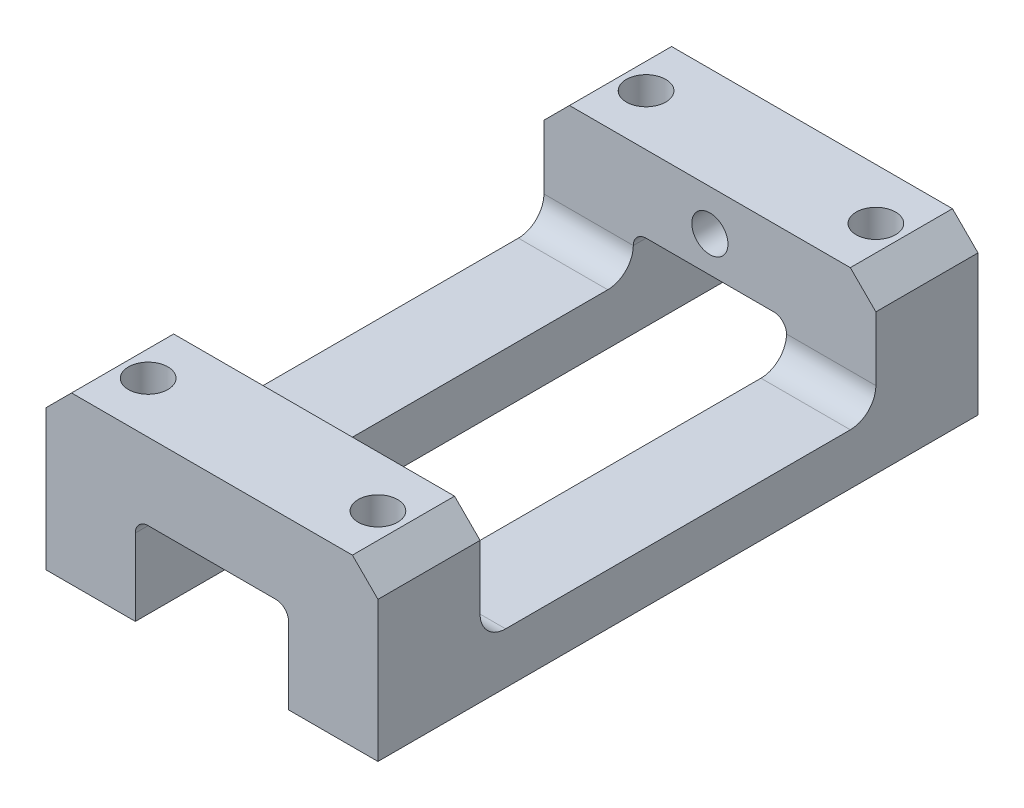
ISO-10303-21;
HEADER;
FILE_DESCRIPTION(('STEP AP214'),'2;1');
FILE_NAME('part.step','',(''),(''),'','','');
FILE_SCHEMA(('AUTOMOTIVE_DESIGN { 1 0 10303 214 1 1 1 1 }'));
ENDSEC;
DATA;
#1=APPLICATION_CONTEXT('core data for automotive mechanical design processes');
#2=APPLICATION_PROTOCOL_DEFINITION('international standard','automotive_design',2000,#1);
#3=PRODUCT_CONTEXT('',#1,'mechanical');
#4=PRODUCT('Part','Part','',(#3));
#5=PRODUCT_RELATED_PRODUCT_CATEGORY('part','',(#4));
#6=PRODUCT_DEFINITION_FORMATION('','',#4);
#7=PRODUCT_DEFINITION_CONTEXT('part definition',#1,'design');
#8=PRODUCT_DEFINITION('design','',#6,#7);
#9=PRODUCT_DEFINITION_SHAPE('','',#8);
#10=(LENGTH_UNIT() NAMED_UNIT(*) SI_UNIT(.MILLI.,.METRE.));
#11=(NAMED_UNIT(*) PLANE_ANGLE_UNIT() SI_UNIT($,.RADIAN.));
#12=(NAMED_UNIT(*) SI_UNIT($,.STERADIAN.) SOLID_ANGLE_UNIT());
#13=UNCERTAINTY_MEASURE_WITH_UNIT(LENGTH_MEASURE(1.E-05),#10,'distance_accuracy_value','');
#14=(GEOMETRIC_REPRESENTATION_CONTEXT(3) GLOBAL_UNCERTAINTY_ASSIGNED_CONTEXT((#13)) GLOBAL_UNIT_ASSIGNED_CONTEXT((#10,
#11,#12)) REPRESENTATION_CONTEXT('',''));
#15=CARTESIAN_POINT('',(0.,0.,0.));
#16=DIRECTION('',(0.,0.,1.));
#17=DIRECTION('',(1.,0.,0.));
#18=AXIS2_PLACEMENT_3D('',#15,#16,#17);
#19=CARTESIAN_POINT('',(-15.875,19.05,149.225));
#20=DIRECTION('',(0.,0.,-1.));
#21=DIRECTION('',(-1.,0.,0.));
#22=AXIS2_PLACEMENT_3D('',#19,#20,#21);
#23=CYLINDRICAL_SURFACE('',#22,3.175);
#24=DIRECTION('',(0.,0.,-1.));
#25=VECTOR('',#24,1.);
#26=CARTESIAN_POINT('',(-15.875,22.225,149.225));
#27=LINE('',#26,#25);
#28=CARTESIAN_POINT('',(-15.875,22.225,25.4));
#29=VERTEX_POINT('',#28);
#30=CARTESIAN_POINT('',(-15.875,22.225,0.));
#31=VERTEX_POINT('',#30);
#32=EDGE_CURVE('E445',#29,#31,#27,.T.);
#33=ORIENTED_EDGE('',*,*,#32,.F.);
#34=CARTESIAN_POINT('',(-15.875,19.05,25.4));
#35=DIRECTION('',(0.,0.,-1.));
#36=DIRECTION('',(0.,1.,0.));
#37=AXIS2_PLACEMENT_3D('',#34,#35,#36);
#38=CIRCLE('',#37,3.175);
#39=CARTESIAN_POINT('',(-19.05,19.05,25.4));
#40=VERTEX_POINT('',#39);
#41=EDGE_CURVE('E346',#29,#40,#38,.F.);
#42=ORIENTED_EDGE('',*,*,#41,.T.);
#43=DIRECTION('',(0.,0.,-1.));
#44=VECTOR('',#43,1.);
#45=CARTESIAN_POINT('',(-19.05,19.05,149.225));
#46=LINE('',#45,#44);
#47=CARTESIAN_POINT('',(-19.05,19.05,0.));
#48=VERTEX_POINT('',#47);
#49=EDGE_CURVE('E316',#40,#48,#46,.T.);
#50=ORIENTED_EDGE('',*,*,#49,.T.);
#51=CARTESIAN_POINT('',(-15.875,19.05,0.));
#52=DIRECTION('',(0.,0.,1.));
#53=DIRECTION('',(1.,0.,0.));
#54=AXIS2_PLACEMENT_3D('',#51,#52,#53);
#55=CIRCLE('',#54,3.175);
#56=EDGE_CURVE('E405',#48,#31,#55,.F.);
#57=ORIENTED_EDGE('',*,*,#56,.T.);
#58=EDGE_LOOP('',(#33,#42,#50,#57));
#59=FACE_BOUND('',#58,.T.);
#60=ADVANCED_FACE('F51',(#59),#23,.F.);
#61=CARTESIAN_POINT('',(0.,22.225,149.225));
#62=DIRECTION('',(0.,1.,0.));
#63=DIRECTION('',(0.,0.,1.));
#64=AXIS2_PLACEMENT_3D('',#61,#62,#63);
#65=PLANE('',#64);
#66=DIRECTION('',(0.,0.,-1.));
#67=VECTOR('',#66,1.);
#68=CARTESIAN_POINT('',(15.875,22.225,149.225));
#69=LINE('',#68,#67);
#70=CARTESIAN_POINT('',(15.875,22.225,25.4));
#71=VERTEX_POINT('',#70);
#72=CARTESIAN_POINT('',(15.875,22.225,0.));
#73=VERTEX_POINT('',#72);
#74=EDGE_CURVE('E441',#71,#73,#69,.T.);
#75=ORIENTED_EDGE('',*,*,#74,.F.);
#76=DIRECTION('',(-1.,0.,0.));
#77=VECTOR('',#76,1.);
#78=CARTESIAN_POINT('',(0.,22.225,25.4));
#79=LINE('',#78,#77);
#80=EDGE_CURVE('E343',#71,#29,#79,.T.);
#81=ORIENTED_EDGE('',*,*,#80,.T.);
#82=ORIENTED_EDGE('',*,*,#32,.T.);
#83=DIRECTION('',(1.,0.,0.));
#84=VECTOR('',#83,1.);
#85=CARTESIAN_POINT('',(0.,22.225,0.));
#86=LINE('',#85,#84);
#87=EDGE_CURVE('E408',#31,#73,#86,.T.);
#88=ORIENTED_EDGE('',*,*,#87,.T.);
#89=EDGE_LOOP('',(#75,#81,#82,#88));
#90=FACE_BOUND('',#89,.T.);
#91=ADVANCED_FACE('F527',(#90),#65,.F.);
#92=CARTESIAN_POINT('',(15.875,19.05,149.225));
#93=DIRECTION('',(0.,0.,-1.));
#94=DIRECTION('',(-1.,0.,0.));
#95=AXIS2_PLACEMENT_3D('',#92,#93,#94);
#96=CYLINDRICAL_SURFACE('',#95,3.175);
#97=DIRECTION('',(0.,0.,-1.));
#98=VECTOR('',#97,1.);
#99=CARTESIAN_POINT('',(19.05,19.05,149.225));
#100=LINE('',#99,#98);
#101=CARTESIAN_POINT('',(19.05,19.05,25.4));
#102=VERTEX_POINT('',#101);
#103=CARTESIAN_POINT('',(19.05,19.05,0.));
#104=VERTEX_POINT('',#103);
#105=EDGE_CURVE('E437',#102,#104,#100,.T.);
#106=ORIENTED_EDGE('',*,*,#105,.F.);
#107=CARTESIAN_POINT('',(15.875,19.05,25.4));
#108=DIRECTION('',(0.,0.,-1.));
#109=DIRECTION('',(0.,1.,0.));
#110=AXIS2_PLACEMENT_3D('',#107,#108,#109);
#111=CIRCLE('',#110,3.175);
#112=EDGE_CURVE('E340',#102,#71,#111,.F.);
#113=ORIENTED_EDGE('',*,*,#112,.T.);
#114=ORIENTED_EDGE('',*,*,#74,.T.);
#115=CARTESIAN_POINT('',(15.875,19.05,0.));
#116=DIRECTION('',(0.,0.,1.));
#117=DIRECTION('',(1.,0.,0.));
#118=AXIS2_PLACEMENT_3D('',#115,#116,#117);
#119=CIRCLE('',#118,3.175);
#120=EDGE_CURVE('E411',#73,#104,#119,.F.);
#121=ORIENTED_EDGE('',*,*,#120,.T.);
#122=EDGE_LOOP('',(#106,#113,#114,#121));
#123=FACE_BOUND('',#122,.T.);
#124=ADVANCED_FACE('F505',(#123),#96,.F.);
#125=CARTESIAN_POINT('',(0.,41.275,149.225));
#126=DIRECTION('',(0.,1.,0.));
#127=DIRECTION('',(0.,0.,1.));
#128=AXIS2_PLACEMENT_3D('',#125,#126,#127);
#129=PLANE('',#128);
#130=DIRECTION('',(-1.,0.,0.));
#131=VECTOR('',#130,1.);
#132=CARTESIAN_POINT('',(41.275,41.275,25.4));
#133=LINE('',#132,#131);
#134=CARTESIAN_POINT('',(34.925,41.275,25.4));
#135=VERTEX_POINT('',#134);
#136=CARTESIAN_POINT('',(-34.925,41.275,25.4));
#137=VERTEX_POINT('',#136);
#138=EDGE_CURVE('E231',#135,#137,#133,.T.);
#139=ORIENTED_EDGE('',*,*,#138,.F.);
#140=DIRECTION('',(0.,0.,-1.));
#141=VECTOR('',#140,1.);
#142=CARTESIAN_POINT('',(34.925,41.275,0.));
#143=LINE('',#142,#141);
#144=CARTESIAN_POINT('',(34.925,41.275,0.));
#145=VERTEX_POINT('',#144);
#146=EDGE_CURVE('E450',#135,#145,#143,.T.);
#147=ORIENTED_EDGE('',*,*,#146,.T.);
#148=DIRECTION('',(1.,0.,0.));
#149=VECTOR('',#148,1.);
#150=CARTESIAN_POINT('',(0.,41.275,0.));
#151=LINE('',#150,#149);
#152=CARTESIAN_POINT('',(-34.925,41.275,0.));
#153=VERTEX_POINT('',#152);
#154=EDGE_CURVE('E422',#153,#145,#151,.T.);
#155=ORIENTED_EDGE('',*,*,#154,.F.);
#156=DIRECTION('',(0.,0.,1.));
#157=VECTOR('',#156,1.);
#158=CARTESIAN_POINT('',(-34.925,41.275,149.225));
#159=LINE('',#158,#157);
#160=EDGE_CURVE('E448',#153,#137,#159,.T.);
#161=ORIENTED_EDGE('',*,*,#160,.T.);
#162=EDGE_LOOP('',(#139,#147,#155,#161));
#163=FACE_BOUND('',#162,.T.);
#164=CARTESIAN_POINT('',(-28.575,41.275,12.7));
#165=DIRECTION('',(0.,1.,0.));
#166=DIRECTION('',(0.,0.,1.));
#167=AXIS2_PLACEMENT_3D('',#164,#165,#166);
#168=CIRCLE('',#167,4.90219999999999);
#169=CARTESIAN_POINT('',(-28.575,41.275,17.6022));
#170=VERTEX_POINT('',#169);
#171=EDGE_CURVE('E365',#170,#170,#168,.T.);
#172=ORIENTED_EDGE('',*,*,#171,.F.);
#173=EDGE_LOOP('',(#172));
#174=FACE_BOUND('',#173,.T.);
#175=CARTESIAN_POINT('',(28.575,41.275,12.7));
#176=DIRECTION('',(0.,1.,0.));
#177=DIRECTION('',(0.,0.,1.));
#178=AXIS2_PLACEMENT_3D('',#175,#176,#177);
#179=CIRCLE('',#178,4.90219999999999);
#180=CARTESIAN_POINT('',(28.575,41.275,17.6022));
#181=VERTEX_POINT('',#180);
#182=EDGE_CURVE('E353',#181,#181,#179,.T.);
#183=ORIENTED_EDGE('',*,*,#182,.F.);
#184=EDGE_LOOP('',(#183));
#185=FACE_BOUND('',#184,.T.);
#186=ADVANCED_FACE('F596',(#163,#174,#185),#129,.T.);
#187=CARTESIAN_POINT('',(34.925,41.275,149.225));
#188=DIRECTION('',(0.707106781186547,0.707106781186547,0.));
#189=DIRECTION('',(0.,0.,1.));
#190=AXIS2_PLACEMENT_3D('',#187,#188,#189);
#191=PLANE('',#190);
#192=DIRECTION('',(-0.707106781186548,0.707106781186548,0.));
#193=VECTOR('',#192,1.);
#194=CARTESIAN_POINT('',(34.925,41.275,25.4));
#195=LINE('',#194,#193);
#196=CARTESIAN_POINT('',(41.275,34.925,25.4));
#197=VERTEX_POINT('',#196);
#198=EDGE_CURVE('E310',#197,#135,#195,.T.);
#199=ORIENTED_EDGE('',*,*,#198,.F.);
#200=DIRECTION('',(0.,0.,1.));
#201=VECTOR('',#200,1.);
#202=CARTESIAN_POINT('',(41.275,34.925,149.225));
#203=LINE('',#202,#201);
#204=CARTESIAN_POINT('',(41.275,34.925,0.));
#205=VERTEX_POINT('',#204);
#206=EDGE_CURVE('E458',#205,#197,#203,.T.);
#207=ORIENTED_EDGE('',*,*,#206,.F.);
#208=DIRECTION('',(0.707106781186548,-0.707106781186548,0.));
#209=VECTOR('',#208,1.);
#210=CARTESIAN_POINT('',(34.925,41.275,0.));
#211=LINE('',#210,#209);
#212=EDGE_CURVE('E455',#145,#205,#211,.T.);
#213=ORIENTED_EDGE('',*,*,#212,.F.);
#214=ORIENTED_EDGE('',*,*,#146,.F.);
#215=EDGE_LOOP('',(#199,#207,#213,#214));
#216=FACE_BOUND('',#215,.T.);
#217=ADVANCED_FACE('F554',(#216),#191,.T.);
#218=CARTESIAN_POINT('',(-41.275,34.925,149.225));
#219=DIRECTION('',(0.707106781186547,-0.707106781186547,0.));
#220=DIRECTION('',(0.,0.,-1.));
#221=AXIS2_PLACEMENT_3D('',#218,#219,#220);
#222=PLANE('',#221);
#223=DIRECTION('',(0.707106781186548,0.707106781186548,0.));
#224=VECTOR('',#223,1.);
#225=CARTESIAN_POINT('',(-41.275,34.925,25.4));
#226=LINE('',#225,#224);
#227=CARTESIAN_POINT('',(-41.275,34.925,25.4));
#228=VERTEX_POINT('',#227);
#229=EDGE_CURVE('E224',#137,#228,#226,.F.);
#230=ORIENTED_EDGE('',*,*,#229,.F.);
#231=ORIENTED_EDGE('',*,*,#160,.F.);
#232=DIRECTION('',(-0.707106781186548,-0.707106781186548,0.));
#233=VECTOR('',#232,1.);
#234=CARTESIAN_POINT('',(-41.275,34.925,0.));
#235=LINE('',#234,#233);
#236=CARTESIAN_POINT('',(-41.275,34.925,0.));
#237=VERTEX_POINT('',#236);
#238=EDGE_CURVE('E249',#237,#153,#235,.F.);
#239=ORIENTED_EDGE('',*,*,#238,.F.);
#240=DIRECTION('',(0.,0.,-1.));
#241=VECTOR('',#240,1.);
#242=CARTESIAN_POINT('',(-41.275,34.925,149.225));
#243=LINE('',#242,#241);
#244=EDGE_CURVE('E242',#228,#237,#243,.T.);
#245=ORIENTED_EDGE('',*,*,#244,.F.);
#246=EDGE_LOOP('',(#230,#231,#239,#245));
#247=FACE_BOUND('',#246,.T.);
#248=ADVANCED_FACE('F248',(#247),#222,.F.);
#249=CARTESIAN_POINT('',(-19.05,0.,149.225));
#250=DIRECTION('',(-1.,0.,0.));
#251=DIRECTION('',(0.,0.,1.));
#252=AXIS2_PLACEMENT_3D('',#249,#250,#251);
#253=PLANE('',#252);
#254=ORIENTED_EDGE('',*,*,#49,.F.);
#255=CARTESIAN_POINT('',(-19.05,19.05,31.75));
#256=DIRECTION('',(-1.,0.,0.));
#257=DIRECTION('',(0.,0.,1.));
#258=AXIS2_PLACEMENT_3D('',#255,#256,#257);
#259=CIRCLE('',#258,6.35);
#260=CARTESIAN_POINT('',(-19.05,12.7,31.75));
#261=VERTEX_POINT('',#260);
#262=EDGE_CURVE('E11',#40,#261,#259,.T.);
#263=ORIENTED_EDGE('',*,*,#262,.T.);
#264=DIRECTION('',(0.,0.,1.));
#265=VECTOR('',#264,1.);
#266=CARTESIAN_POINT('',(-19.05,12.7,149.225));
#267=LINE('',#266,#265);
#268=CARTESIAN_POINT('',(-19.05,12.7,117.475));
#269=VERTEX_POINT('',#268);
#270=EDGE_CURVE('E296',#261,#269,#267,.T.);
#271=ORIENTED_EDGE('',*,*,#270,.T.);
#272=CARTESIAN_POINT('',(-19.05,19.05,117.475));
#273=DIRECTION('',(-1.,0.,0.));
#274=DIRECTION('',(0.,0.,1.));
#275=AXIS2_PLACEMENT_3D('',#272,#273,#274);
#276=CIRCLE('',#275,6.35);
#277=CARTESIAN_POINT('',(-19.05,19.05,123.825));
#278=VERTEX_POINT('',#277);
#279=EDGE_CURVE('E288',#269,#278,#276,.T.);
#280=ORIENTED_EDGE('',*,*,#279,.T.);
#281=CARTESIAN_POINT('',(-19.05,19.05,149.225));
#282=VERTEX_POINT('',#281);
#283=EDGE_CURVE('E295',#282,#278,#46,.T.);
#284=ORIENTED_EDGE('',*,*,#283,.F.);
#285=DIRECTION('',(0.,1.,0.));
#286=VECTOR('',#285,1.);
#287=CARTESIAN_POINT('',(-19.05,0.,149.225));
#288=LINE('',#287,#286);
#289=CARTESIAN_POINT('',(-19.05,0.,149.225));
#290=VERTEX_POINT('',#289);
#291=EDGE_CURVE('E378',#290,#282,#288,.T.);
#292=ORIENTED_EDGE('',*,*,#291,.F.);
#293=DIRECTION('',(0.,0.,-1.));
#294=VECTOR('',#293,1.);
#295=CARTESIAN_POINT('',(-19.05,0.,149.225));
#296=LINE('',#295,#294);
#297=CARTESIAN_POINT('',(-19.05,0.,0.));
#298=VERTEX_POINT('',#297);
#299=EDGE_CURVE('E402',#290,#298,#296,.T.);
#300=ORIENTED_EDGE('',*,*,#299,.T.);
#301=DIRECTION('',(0.,1.,0.));
#302=VECTOR('',#301,1.);
#303=CARTESIAN_POINT('',(-19.05,0.,0.));
#304=LINE('',#303,#302);
#305=EDGE_CURVE('E377',#298,#48,#304,.T.);
#306=ORIENTED_EDGE('',*,*,#305,.T.);
#307=EDGE_LOOP('',(#254,#263,#271,#280,#284,#292,#300,#306));
#308=FACE_BOUND('',#307,.T.);
#309=ADVANCED_FACE('F292',(#308),#253,.F.);
#310=ORIENTED_EDGE('',*,*,#283,.T.);
#311=CARTESIAN_POINT('',(-15.875,19.05,123.825));
#312=DIRECTION('',(0.,0.,1.));
#313=DIRECTION('',(1.,0.,0.));
#314=AXIS2_PLACEMENT_3D('',#311,#312,#313);
#315=CIRCLE('',#314,3.175);
#316=CARTESIAN_POINT('',(-15.875,22.225,123.825));
#317=VERTEX_POINT('',#316);
#318=EDGE_CURVE('E301',#278,#317,#315,.F.);
#319=ORIENTED_EDGE('',*,*,#318,.T.);
#320=CARTESIAN_POINT('',(-15.875,22.225,149.225));
#321=VERTEX_POINT('',#320);
#322=EDGE_CURVE('E446',#321,#317,#27,.T.);
#323=ORIENTED_EDGE('',*,*,#322,.F.);
#324=CARTESIAN_POINT('',(-15.875,19.05,149.225));
#325=DIRECTION('',(0.,0.,1.));
#326=DIRECTION('',(1.,0.,0.));
#327=AXIS2_PLACEMENT_3D('',#324,#325,#326);
#328=CIRCLE('',#327,3.175);
#329=EDGE_CURVE('E313',#282,#321,#328,.F.);
#330=ORIENTED_EDGE('',*,*,#329,.F.);
#331=EDGE_LOOP('',(#310,#319,#323,#330));
#332=FACE_BOUND('',#331,.T.);
#333=ADVANCED_FACE('F312',(#332),#23,.F.);
#334=ORIENTED_EDGE('',*,*,#322,.T.);
#335=DIRECTION('',(1.,0.,0.));
#336=VECTOR('',#335,1.);
#337=CARTESIAN_POINT('',(0.,22.225,123.825));
#338=LINE('',#337,#336);
#339=CARTESIAN_POINT('',(15.875,22.225,123.825));
#340=VERTEX_POINT('',#339);
#341=EDGE_CURVE('E306',#317,#340,#338,.T.);
#342=ORIENTED_EDGE('',*,*,#341,.T.);
#343=CARTESIAN_POINT('',(15.875,22.225,149.225));
#344=VERTEX_POINT('',#343);
#345=EDGE_CURVE('E442',#344,#340,#69,.T.);
#346=ORIENTED_EDGE('',*,*,#345,.F.);
#347=DIRECTION('',(1.,0.,0.));
#348=VECTOR('',#347,1.);
#349=CARTESIAN_POINT('',(0.,22.225,149.225));
#350=LINE('',#349,#348);
#351=EDGE_CURVE('E382',#321,#344,#350,.T.);
#352=ORIENTED_EDGE('',*,*,#351,.F.);
#353=EDGE_LOOP('',(#334,#342,#346,#352));
#354=FACE_BOUND('',#353,.T.);
#355=ADVANCED_FACE('F524',(#354),#65,.F.);
#356=ORIENTED_EDGE('',*,*,#345,.T.);
#357=CARTESIAN_POINT('',(15.875,19.05,123.825));
#358=DIRECTION('',(0.,0.,1.));
#359=DIRECTION('',(1.,0.,0.));
#360=AXIS2_PLACEMENT_3D('',#357,#358,#359);
#361=CIRCLE('',#360,3.175);
#362=CARTESIAN_POINT('',(19.05,19.05,123.825));
#363=VERTEX_POINT('',#362);
#364=EDGE_CURVE('E335',#340,#363,#361,.F.);
#365=ORIENTED_EDGE('',*,*,#364,.T.);
#366=CARTESIAN_POINT('',(19.05,19.05,149.225));
#367=VERTEX_POINT('',#366);
#368=EDGE_CURVE('E438',#367,#363,#100,.T.);
#369=ORIENTED_EDGE('',*,*,#368,.F.);
#370=CARTESIAN_POINT('',(15.875,19.05,149.225));
#371=DIRECTION('',(0.,0.,1.));
#372=DIRECTION('',(1.,0.,0.));
#373=AXIS2_PLACEMENT_3D('',#370,#371,#372);
#374=CIRCLE('',#373,3.175);
#375=EDGE_CURVE('E384',#344,#367,#374,.F.);
#376=ORIENTED_EDGE('',*,*,#375,.F.);
#377=EDGE_LOOP('',(#356,#365,#369,#376));
#378=FACE_BOUND('',#377,.T.);
#379=ADVANCED_FACE('F522',(#378),#96,.F.);
#380=CARTESIAN_POINT('',(19.05,0.,149.225));
#381=DIRECTION('',(-1.,0.,0.));
#382=DIRECTION('',(0.,0.,1.));
#383=AXIS2_PLACEMENT_3D('',#380,#381,#382);
#384=PLANE('',#383);
#385=DIRECTION('',(0.,0.,1.));
#386=VECTOR('',#385,1.);
#387=CARTESIAN_POINT('',(19.05,12.7,149.225));
#388=LINE('',#387,#386);
#389=CARTESIAN_POINT('',(19.05,12.7,31.75));
#390=VERTEX_POINT('',#389);
#391=CARTESIAN_POINT('',(19.05,12.7,117.475));
#392=VERTEX_POINT('',#391);
#393=EDGE_CURVE('E349',#390,#392,#388,.T.);
#394=ORIENTED_EDGE('',*,*,#393,.F.);
#395=CARTESIAN_POINT('',(19.05,19.05,31.75));
#396=DIRECTION('',(-1.,0.,0.));
#397=DIRECTION('',(0.,0.,1.));
#398=AXIS2_PLACEMENT_3D('',#395,#396,#397);
#399=CIRCLE('',#398,6.35);
#400=EDGE_CURVE('E278',#390,#102,#399,.F.);
#401=ORIENTED_EDGE('',*,*,#400,.T.);
#402=ORIENTED_EDGE('',*,*,#105,.T.);
#403=DIRECTION('',(0.,1.,0.));
#404=VECTOR('',#403,1.);
#405=CARTESIAN_POINT('',(19.05,0.,0.));
#406=LINE('',#405,#404);
#407=CARTESIAN_POINT('',(19.05,0.,0.));
#408=VERTEX_POINT('',#407);
#409=EDGE_CURVE('E414',#408,#104,#406,.T.);
#410=ORIENTED_EDGE('',*,*,#409,.F.);
#411=DIRECTION('',(0.,0.,-1.));
#412=VECTOR('',#411,1.);
#413=CARTESIAN_POINT('',(19.05,0.,149.225));
#414=LINE('',#413,#412);
#415=CARTESIAN_POINT('',(19.05,0.,149.225));
#416=VERTEX_POINT('',#415);
#417=EDGE_CURVE('E435',#416,#408,#414,.T.);
#418=ORIENTED_EDGE('',*,*,#417,.F.);
#419=DIRECTION('',(0.,1.,0.));
#420=VECTOR('',#419,1.);
#421=CARTESIAN_POINT('',(19.05,0.,149.225));
#422=LINE('',#421,#420);
#423=EDGE_CURVE('E386',#416,#367,#422,.T.);
#424=ORIENTED_EDGE('',*,*,#423,.T.);
#425=ORIENTED_EDGE('',*,*,#368,.T.);
#426=CARTESIAN_POINT('',(19.05,19.05,117.475));
#427=DIRECTION('',(-1.,0.,0.));
#428=DIRECTION('',(0.,0.,1.));
#429=AXIS2_PLACEMENT_3D('',#426,#427,#428);
#430=CIRCLE('',#429,6.35);
#431=EDGE_CURVE('E282',#363,#392,#430,.F.);
#432=ORIENTED_EDGE('',*,*,#431,.T.);
#433=EDGE_LOOP('',(#394,#401,#402,#410,#418,#424,#425,#432));
#434=FACE_BOUND('',#433,.T.);
#435=ADVANCED_FACE('F489',(#434),#384,.T.);
#436=CARTESIAN_POINT('',(0.,0.,149.225));
#437=DIRECTION('',(0.,1.,0.));
#438=DIRECTION('',(0.,0.,1.));
#439=AXIS2_PLACEMENT_3D('',#436,#437,#438);
#440=PLANE('',#439);
#441=CARTESIAN_POINT('',(28.575,0.,12.7));
#442=DIRECTION('',(0.,1.,0.));
#443=DIRECTION('',(0.,0.,1.));
#444=AXIS2_PLACEMENT_3D('',#441,#442,#443);
#445=CIRCLE('',#444,4.90219999999996);
#446=CARTESIAN_POINT('',(28.575,0.,17.6022));
#447=VERTEX_POINT('',#446);
#448=EDGE_CURVE('E356',#447,#447,#445,.T.);
#449=ORIENTED_EDGE('',*,*,#448,.T.);
#450=EDGE_LOOP('',(#449));
#451=FACE_BOUND('',#450,.T.);
#452=CARTESIAN_POINT('',(28.575,0.,136.525));
#453=DIRECTION('',(0.,1.,0.));
#454=DIRECTION('',(0.,0.,1.));
#455=AXIS2_PLACEMENT_3D('',#452,#453,#454);
#456=CIRCLE('',#455,4.90219999999996);
#457=CARTESIAN_POINT('',(28.575,0.,141.4272));
#458=VERTEX_POINT('',#457);
#459=EDGE_CURVE('E374',#458,#458,#456,.T.);
#460=ORIENTED_EDGE('',*,*,#459,.T.);
#461=EDGE_LOOP('',(#460));
#462=FACE_BOUND('',#461,.T.);
#463=DIRECTION('',(1.,0.,0.));
#464=VECTOR('',#463,1.);
#465=CARTESIAN_POINT('',(0.,0.,0.));
#466=LINE('',#465,#464);
#467=CARTESIAN_POINT('',(41.275,0.,0.));
#468=VERTEX_POINT('',#467);
#469=EDGE_CURVE('E417',#408,#468,#466,.T.);
#470=ORIENTED_EDGE('',*,*,#469,.T.);
#471=DIRECTION('',(0.,0.,-1.));
#472=VECTOR('',#471,1.);
#473=CARTESIAN_POINT('',(41.275,0.,149.225));
#474=LINE('',#473,#472);
#475=CARTESIAN_POINT('',(41.275,0.,149.225));
#476=VERTEX_POINT('',#475);
#477=EDGE_CURVE('E432',#476,#468,#474,.T.);
#478=ORIENTED_EDGE('',*,*,#477,.F.);
#479=DIRECTION('',(1.,0.,0.));
#480=VECTOR('',#479,1.);
#481=CARTESIAN_POINT('',(0.,0.,149.225));
#482=LINE('',#481,#480);
#483=EDGE_CURVE('E389',#416,#476,#482,.T.);
#484=ORIENTED_EDGE('',*,*,#483,.F.);
#485=ORIENTED_EDGE('',*,*,#417,.T.);
#486=EDGE_LOOP('',(#470,#478,#484,#485));
#487=FACE_BOUND('',#486,.T.);
#488=ADVANCED_FACE('F516',(#451,#462,#487),#440,.F.);
#489=CARTESIAN_POINT('',(41.275,0.,149.225));
#490=DIRECTION('',(-1.,0.,0.));
#491=DIRECTION('',(0.,0.,1.));
#492=AXIS2_PLACEMENT_3D('',#489,#490,#491);
#493=PLANE('',#492);
#494=ORIENTED_EDGE('',*,*,#206,.T.);
#495=DIRECTION('',(0.,-1.,0.));
#496=VECTOR('',#495,1.);
#497=CARTESIAN_POINT('',(41.275,41.275,25.4));
#498=LINE('',#497,#496);
#499=CARTESIAN_POINT('',(41.275,19.05,25.4));
#500=VERTEX_POINT('',#499);
#501=EDGE_CURVE('E323',#197,#500,#498,.T.);
#502=ORIENTED_EDGE('',*,*,#501,.T.);
#503=CARTESIAN_POINT('',(41.275,19.05,31.75));
#504=DIRECTION('',(-1.,0.,0.));
#505=DIRECTION('',(0.,0.,1.));
#506=AXIS2_PLACEMENT_3D('',#503,#504,#505);
#507=CIRCLE('',#506,6.35);
#508=CARTESIAN_POINT('',(41.275,12.7,31.75));
#509=VERTEX_POINT('',#508);
#510=EDGE_CURVE('E280',#500,#509,#507,.T.);
#511=ORIENTED_EDGE('',*,*,#510,.T.);
#512=DIRECTION('',(0.,0.,1.));
#513=VECTOR('',#512,1.);
#514=CARTESIAN_POINT('',(41.275,12.7,25.4));
#515=LINE('',#514,#513);
#516=CARTESIAN_POINT('',(41.275,12.7,117.475));
#517=VERTEX_POINT('',#516);
#518=EDGE_CURVE('E482',#509,#517,#515,.T.);
#519=ORIENTED_EDGE('',*,*,#518,.T.);
#520=CARTESIAN_POINT('',(41.275,19.05,117.475));
#521=DIRECTION('',(-1.,0.,0.));
#522=DIRECTION('',(0.,0.,1.));
#523=AXIS2_PLACEMENT_3D('',#520,#521,#522);
#524=CIRCLE('',#523,6.35);
#525=CARTESIAN_POINT('',(41.275,19.05,123.825));
#526=VERTEX_POINT('',#525);
#527=EDGE_CURVE('E284',#517,#526,#524,.T.);
#528=ORIENTED_EDGE('',*,*,#527,.T.);
#529=DIRECTION('',(0.,1.,0.));
#530=VECTOR('',#529,1.);
#531=CARTESIAN_POINT('',(41.275,41.275,123.825));
#532=LINE('',#531,#530);
#533=CARTESIAN_POINT('',(41.275,34.925,123.825));
#534=VERTEX_POINT('',#533);
#535=EDGE_CURVE('E332',#526,#534,#532,.T.);
#536=ORIENTED_EDGE('',*,*,#535,.T.);
#537=CARTESIAN_POINT('',(41.275,34.925,149.225));
#538=VERTEX_POINT('',#537);
#539=EDGE_CURVE('E457',#534,#538,#203,.T.);
#540=ORIENTED_EDGE('',*,*,#539,.T.);
#541=DIRECTION('',(0.,1.,0.));
#542=VECTOR('',#541,1.);
#543=CARTESIAN_POINT('',(41.275,0.,149.225));
#544=LINE('',#543,#542);
#545=EDGE_CURVE('E391',#476,#538,#544,.T.);
#546=ORIENTED_EDGE('',*,*,#545,.F.);
#547=ORIENTED_EDGE('',*,*,#477,.T.);
#548=DIRECTION('',(0.,1.,0.));
#549=VECTOR('',#548,1.);
#550=CARTESIAN_POINT('',(41.275,0.,0.));
#551=LINE('',#550,#549);
#552=EDGE_CURVE('E419',#468,#205,#551,.T.);
#553=ORIENTED_EDGE('',*,*,#552,.T.);
#554=EDGE_LOOP('',(#494,#502,#511,#519,#528,#536,#540,#546,#547,#553));
#555=FACE_BOUND('',#554,.T.);
#556=ADVANCED_FACE('F595',(#555),#493,.F.);
#557=DIRECTION('',(-1.,0.,0.));
#558=VECTOR('',#557,1.);
#559=CARTESIAN_POINT('',(41.275,41.275,123.825));
#560=LINE('',#559,#558);
#561=CARTESIAN_POINT('',(34.925,41.275,123.825));
#562=VERTEX_POINT('',#561);
#563=CARTESIAN_POINT('',(-34.925,41.275,123.825));
#564=VERTEX_POINT('',#563);
#565=EDGE_CURVE('E329',#562,#564,#560,.T.);
#566=ORIENTED_EDGE('',*,*,#565,.T.);
#567=CARTESIAN_POINT('',(-34.925,41.275,149.225));
#568=VERTEX_POINT('',#567);
#569=EDGE_CURVE('E315',#564,#568,#159,.T.);
#570=ORIENTED_EDGE('',*,*,#569,.T.);
#571=DIRECTION('',(1.,0.,0.));
#572=VECTOR('',#571,1.);
#573=CARTESIAN_POINT('',(0.,41.275,149.225));
#574=LINE('',#573,#572);
#575=CARTESIAN_POINT('',(34.925,41.275,149.225));
#576=VERTEX_POINT('',#575);
#577=EDGE_CURVE('E394',#568,#576,#574,.T.);
#578=ORIENTED_EDGE('',*,*,#577,.T.);
#579=EDGE_CURVE('E451',#576,#562,#143,.T.);
#580=ORIENTED_EDGE('',*,*,#579,.T.);
#581=EDGE_LOOP('',(#566,#570,#578,#580));
#582=FACE_BOUND('',#581,.T.);
#583=CARTESIAN_POINT('',(-28.575,41.275,136.525));
#584=DIRECTION('',(0.,1.,0.));
#585=DIRECTION('',(0.,0.,1.));
#586=AXIS2_PLACEMENT_3D('',#583,#584,#585);
#587=CIRCLE('',#586,4.90219999999999);
#588=CARTESIAN_POINT('',(-28.575,41.275,141.4272));
#589=VERTEX_POINT('',#588);
#590=EDGE_CURVE('E359',#589,#589,#587,.T.);
#591=ORIENTED_EDGE('',*,*,#590,.F.);
#592=EDGE_LOOP('',(#591));
#593=FACE_BOUND('',#592,.T.);
#594=CARTESIAN_POINT('',(28.575,41.275,136.525));
#595=DIRECTION('',(0.,1.,0.));
#596=DIRECTION('',(0.,0.,1.));
#597=AXIS2_PLACEMENT_3D('',#594,#595,#596);
#598=CIRCLE('',#597,4.90219999999999);
#599=CARTESIAN_POINT('',(28.575,41.275,141.4272));
#600=VERTEX_POINT('',#599);
#601=EDGE_CURVE('E371',#600,#600,#598,.T.);
#602=ORIENTED_EDGE('',*,*,#601,.F.);
#603=EDGE_LOOP('',(#602));
#604=FACE_BOUND('',#603,.T.);
#605=ADVANCED_FACE('F473',(#582,#593,#604),#129,.T.);
#606=CARTESIAN_POINT('',(-41.275,0.,149.225));
#607=DIRECTION('',(-1.,0.,0.));
#608=DIRECTION('',(0.,0.,1.));
#609=AXIS2_PLACEMENT_3D('',#606,#607,#608);
#610=PLANE('',#609);
#611=DIRECTION('',(0.,-1.,0.));
#612=VECTOR('',#611,1.);
#613=CARTESIAN_POINT('',(-41.275,41.275,25.4));
#614=LINE('',#613,#612);
#615=CARTESIAN_POINT('',(-41.275,19.05,25.4));
#616=VERTEX_POINT('',#615);
#617=EDGE_CURVE('E228',#228,#616,#614,.T.);
#618=ORIENTED_EDGE('',*,*,#617,.F.);
#619=ORIENTED_EDGE('',*,*,#244,.T.);
#620=DIRECTION('',(0.,1.,0.));
#621=VECTOR('',#620,1.);
#622=CARTESIAN_POINT('',(-41.275,0.,0.));
#623=LINE('',#622,#621);
#624=CARTESIAN_POINT('',(-41.275,0.,0.));
#625=VERTEX_POINT('',#624);
#626=EDGE_CURVE('E425',#625,#237,#623,.T.);
#627=ORIENTED_EDGE('',*,*,#626,.F.);
#628=DIRECTION('',(0.,0.,-1.));
#629=VECTOR('',#628,1.);
#630=CARTESIAN_POINT('',(-41.275,0.,149.225));
#631=LINE('',#630,#629);
#632=CARTESIAN_POINT('',(-41.275,0.,149.225));
#633=VERTEX_POINT('',#632);
#634=EDGE_CURVE('E430',#633,#625,#631,.T.);
#635=ORIENTED_EDGE('',*,*,#634,.F.);
#636=DIRECTION('',(0.,1.,0.));
#637=VECTOR('',#636,1.);
#638=CARTESIAN_POINT('',(-41.275,0.,149.225));
#639=LINE('',#638,#637);
#640=CARTESIAN_POINT('',(-41.275,34.925,149.225));
#641=VERTEX_POINT('',#640);
#642=EDGE_CURVE('E397',#633,#641,#639,.T.);
#643=ORIENTED_EDGE('',*,*,#642,.T.);
#644=CARTESIAN_POINT('',(-41.275,34.925,123.825));
#645=VERTEX_POINT('',#644);
#646=EDGE_CURVE('E251',#641,#645,#243,.T.);
#647=ORIENTED_EDGE('',*,*,#646,.T.);
#648=DIRECTION('',(0.,1.,0.));
#649=VECTOR('',#648,1.);
#650=CARTESIAN_POINT('',(-41.275,41.275,123.825));
#651=LINE('',#650,#649);
#652=CARTESIAN_POINT('',(-41.275,19.05,123.825));
#653=VERTEX_POINT('',#652);
#654=EDGE_CURVE('E319',#653,#645,#651,.T.);
#655=ORIENTED_EDGE('',*,*,#654,.F.);
#656=CARTESIAN_POINT('',(-41.275,19.05,117.475));
#657=DIRECTION('',(-1.,0.,0.));
#658=DIRECTION('',(0.,0.,1.));
#659=AXIS2_PLACEMENT_3D('',#656,#657,#658);
#660=CIRCLE('',#659,6.35);
#661=CARTESIAN_POINT('',(-41.275,12.7,117.475));
#662=VERTEX_POINT('',#661);
#663=EDGE_CURVE('E286',#653,#662,#660,.F.);
#664=ORIENTED_EDGE('',*,*,#663,.T.);
#665=DIRECTION('',(0.,0.,1.));
#666=VECTOR('',#665,1.);
#667=CARTESIAN_POINT('',(-41.275,12.7,25.4));
#668=LINE('',#667,#666);
#669=CARTESIAN_POINT('',(-41.275,12.7,31.75));
#670=VERTEX_POINT('',#669);
#671=EDGE_CURVE('E245',#670,#662,#668,.T.);
#672=ORIENTED_EDGE('',*,*,#671,.F.);
#673=CARTESIAN_POINT('',(-41.275,19.05,31.75));
#674=DIRECTION('',(-1.,0.,0.));
#675=DIRECTION('',(0.,0.,1.));
#676=AXIS2_PLACEMENT_3D('',#673,#674,#675);
#677=CIRCLE('',#676,6.35);
#678=EDGE_CURVE('E59',#670,#616,#677,.F.);
#679=ORIENTED_EDGE('',*,*,#678,.T.);
#680=EDGE_LOOP('',(#618,#619,#627,#635,#643,#647,#655,#664,#672,#679));
#681=FACE_BOUND('',#680,.T.);
#682=ADVANCED_FACE('F240',(#681),#610,.T.);
#683=CARTESIAN_POINT('',(0.,0.,149.225));
#684=DIRECTION('',(0.,1.,0.));
#685=DIRECTION('',(0.,0.,1.));
#686=AXIS2_PLACEMENT_3D('',#683,#684,#685);
#687=PLANE('',#686);
#688=CARTESIAN_POINT('',(-28.575,0.,136.525));
#689=DIRECTION('',(0.,1.,0.));
#690=DIRECTION('',(0.,0.,1.));
#691=AXIS2_PLACEMENT_3D('',#688,#689,#690);
#692=CIRCLE('',#691,4.90219999999996);
#693=CARTESIAN_POINT('',(-28.575,0.,141.4272));
#694=VERTEX_POINT('',#693);
#695=EDGE_CURVE('E362',#694,#694,#692,.T.);
#696=ORIENTED_EDGE('',*,*,#695,.T.);
#697=EDGE_LOOP('',(#696));
#698=FACE_BOUND('',#697,.T.);
#699=CARTESIAN_POINT('',(-28.575,0.,12.7));
#700=DIRECTION('',(0.,1.,0.));
#701=DIRECTION('',(0.,0.,1.));
#702=AXIS2_PLACEMENT_3D('',#699,#700,#701);
#703=CIRCLE('',#702,4.90219999999996);
#704=CARTESIAN_POINT('',(-28.575,0.,17.6022));
#705=VERTEX_POINT('',#704);
#706=EDGE_CURVE('E368',#705,#705,#703,.T.);
#707=ORIENTED_EDGE('',*,*,#706,.T.);
#708=EDGE_LOOP('',(#707));
#709=FACE_BOUND('',#708,.T.);
#710=DIRECTION('',(1.,0.,0.));
#711=VECTOR('',#710,1.);
#712=CARTESIAN_POINT('',(0.,0.,0.));
#713=LINE('',#712,#711);
#714=EDGE_CURVE('E380',#625,#298,#713,.T.);
#715=ORIENTED_EDGE('',*,*,#714,.T.);
#716=ORIENTED_EDGE('',*,*,#299,.F.);
#717=DIRECTION('',(1.,0.,0.));
#718=VECTOR('',#717,1.);
#719=CARTESIAN_POINT('',(0.,0.,149.225));
#720=LINE('',#719,#718);
#721=EDGE_CURVE('E400',#633,#290,#720,.T.);
#722=ORIENTED_EDGE('',*,*,#721,.F.);
#723=ORIENTED_EDGE('',*,*,#634,.T.);
#724=EDGE_LOOP('',(#715,#716,#722,#723));
#725=FACE_BOUND('',#724,.T.);
#726=ADVANCED_FACE('F579',(#698,#709,#725),#687,.F.);
#727=CARTESIAN_POINT('',(0.,0.,149.225));
#728=DIRECTION('',(0.,0.,1.));
#729=DIRECTION('',(1.,0.,0.));
#730=AXIS2_PLACEMENT_3D('',#727,#728,#729);
#731=PLANE('',#730);
#732=ORIENTED_EDGE('',*,*,#545,.T.);
#733=DIRECTION('',(-0.707106781186548,0.707106781186548,0.));
#734=VECTOR('',#733,1.);
#735=CARTESIAN_POINT('',(38.1,38.1,149.225));
#736=LINE('',#735,#734);
#737=EDGE_CURVE('E252',#538,#576,#736,.T.);
#738=ORIENTED_EDGE('',*,*,#737,.T.);
#739=ORIENTED_EDGE('',*,*,#577,.F.);
#740=DIRECTION('',(0.707106781186548,0.707106781186548,0.));
#741=VECTOR('',#740,1.);
#742=CARTESIAN_POINT('',(-38.1,38.1,149.225));
#743=LINE('',#742,#741);
#744=EDGE_CURVE('E255',#568,#641,#743,.F.);
#745=ORIENTED_EDGE('',*,*,#744,.T.);
#746=ORIENTED_EDGE('',*,*,#642,.F.);
#747=ORIENTED_EDGE('',*,*,#721,.T.);
#748=ORIENTED_EDGE('',*,*,#291,.T.);
#749=ORIENTED_EDGE('',*,*,#329,.T.);
#750=ORIENTED_EDGE('',*,*,#351,.T.);
#751=ORIENTED_EDGE('',*,*,#375,.T.);
#752=ORIENTED_EDGE('',*,*,#423,.F.);
#753=ORIENTED_EDGE('',*,*,#483,.T.);
#754=EDGE_LOOP('',(#732,#738,#739,#745,#746,#747,#748,#749,#750,#751,#752,#753));
#755=FACE_BOUND('',#754,.T.);
#756=ADVANCED_FACE('F464',(#755),#731,.T.);
#757=CARTESIAN_POINT('',(0.,0.,0.));
#758=DIRECTION('',(0.,0.,1.));
#759=DIRECTION('',(1.,0.,0.));
#760=AXIS2_PLACEMENT_3D('',#757,#758,#759);
#761=PLANE('',#760);
#762=CARTESIAN_POINT('',(0.,31.115,0.));
#763=DIRECTION('',(0.,0.,1.));
#764=DIRECTION('',(1.,0.,0.));
#765=AXIS2_PLACEMENT_3D('',#762,#763,#764);
#766=CIRCLE('',#765,4.500000017);
#767=CARTESIAN_POINT('',(4.500000017,31.115,0.));
#768=VERTEX_POINT('',#767);
#769=EDGE_CURVE('E246',#768,#768,#766,.F.);
#770=ORIENTED_EDGE('',*,*,#769,.F.);
#771=EDGE_LOOP('',(#770));
#772=FACE_BOUND('',#771,.T.);
#773=ORIENTED_EDGE('',*,*,#154,.T.);
#774=ORIENTED_EDGE('',*,*,#212,.T.);
#775=ORIENTED_EDGE('',*,*,#552,.F.);
#776=ORIENTED_EDGE('',*,*,#469,.F.);
#777=ORIENTED_EDGE('',*,*,#409,.T.);
#778=ORIENTED_EDGE('',*,*,#120,.F.);
#779=ORIENTED_EDGE('',*,*,#87,.F.);
#780=ORIENTED_EDGE('',*,*,#56,.F.);
#781=ORIENTED_EDGE('',*,*,#305,.F.);
#782=ORIENTED_EDGE('',*,*,#714,.F.);
#783=ORIENTED_EDGE('',*,*,#626,.T.);
#784=ORIENTED_EDGE('',*,*,#238,.T.);
#785=EDGE_LOOP('',(#773,#774,#775,#776,#777,#778,#779,#780,#781,#782,#783,#784));
#786=FACE_BOUND('',#785,.T.);
#787=ADVANCED_FACE('F510',(#772,#786),#761,.F.);
#788=DIRECTION('',(0.707106781186548,-0.707106781186548,0.));
#789=VECTOR('',#788,1.);
#790=CARTESIAN_POINT('',(34.925,41.275,123.825));
#791=LINE('',#790,#789);
#792=EDGE_CURVE('E328',#562,#534,#791,.T.);
#793=ORIENTED_EDGE('',*,*,#792,.F.);
#794=ORIENTED_EDGE('',*,*,#579,.F.);
#795=ORIENTED_EDGE('',*,*,#737,.F.);
#796=ORIENTED_EDGE('',*,*,#539,.F.);
#797=EDGE_LOOP('',(#793,#794,#795,#796));
#798=FACE_BOUND('',#797,.T.);
#799=ADVANCED_FACE('F478',(#798),#191,.T.);
#800=DIRECTION('',(-0.707106781186548,-0.707106781186548,0.));
#801=VECTOR('',#800,1.);
#802=CARTESIAN_POINT('',(-41.275,34.925,123.825));
#803=LINE('',#802,#801);
#804=EDGE_CURVE('E237',#645,#564,#803,.F.);
#805=ORIENTED_EDGE('',*,*,#804,.F.);
#806=ORIENTED_EDGE('',*,*,#646,.F.);
#807=ORIENTED_EDGE('',*,*,#744,.F.);
#808=ORIENTED_EDGE('',*,*,#569,.F.);
#809=EDGE_LOOP('',(#805,#806,#807,#808));
#810=FACE_BOUND('',#809,.T.);
#811=ADVANCED_FACE('F470',(#810),#222,.F.);
#812=CARTESIAN_POINT('',(28.575,41.275,136.525));
#813=DIRECTION('',(0.,1.,0.));
#814=DIRECTION('',(0.,0.,1.));
#815=AXIS2_PLACEMENT_3D('',#812,#813,#814);
#816=CYLINDRICAL_SURFACE('',#815,4.90219999999997);
#817=ORIENTED_EDGE('',*,*,#459,.F.);
#818=EDGE_LOOP('',(#817));
#819=FACE_BOUND('',#818,.T.);
#820=ORIENTED_EDGE('',*,*,#601,.T.);
#821=EDGE_LOOP('',(#820));
#822=FACE_BOUND('',#821,.T.);
#823=ADVANCED_FACE('F558',(#819,#822),#816,.F.);
#824=CARTESIAN_POINT('',(-28.575,41.275,12.7));
#825=DIRECTION('',(0.,1.,0.));
#826=DIRECTION('',(0.,0.,1.));
#827=AXIS2_PLACEMENT_3D('',#824,#825,#826);
#828=CYLINDRICAL_SURFACE('',#827,4.90219999999998);
#829=ORIENTED_EDGE('',*,*,#706,.F.);
#830=EDGE_LOOP('',(#829));
#831=FACE_BOUND('',#830,.T.);
#832=ORIENTED_EDGE('',*,*,#171,.T.);
#833=EDGE_LOOP('',(#832));
#834=FACE_BOUND('',#833,.T.);
#835=ADVANCED_FACE('F709',(#831,#834),#828,.F.);
#836=CARTESIAN_POINT('',(-28.575,41.275,136.525));
#837=DIRECTION('',(0.,1.,0.));
#838=DIRECTION('',(0.,0.,1.));
#839=AXIS2_PLACEMENT_3D('',#836,#837,#838);
#840=CYLINDRICAL_SURFACE('',#839,4.90219999999998);
#841=ORIENTED_EDGE('',*,*,#695,.F.);
#842=EDGE_LOOP('',(#841));
#843=FACE_BOUND('',#842,.T.);
#844=ORIENTED_EDGE('',*,*,#590,.T.);
#845=EDGE_LOOP('',(#844));
#846=FACE_BOUND('',#845,.T.);
#847=ADVANCED_FACE('F719',(#843,#846),#840,.F.);
#848=CARTESIAN_POINT('',(28.575,41.275,12.7));
#849=DIRECTION('',(0.,1.,0.));
#850=DIRECTION('',(0.,0.,1.));
#851=AXIS2_PLACEMENT_3D('',#848,#849,#850);
#852=CYLINDRICAL_SURFACE('',#851,4.90219999999997);
#853=ORIENTED_EDGE('',*,*,#448,.F.);
#854=EDGE_LOOP('',(#853));
#855=FACE_BOUND('',#854,.T.);
#856=ORIENTED_EDGE('',*,*,#182,.T.);
#857=EDGE_LOOP('',(#856));
#858=FACE_BOUND('',#857,.T.);
#859=ADVANCED_FACE('F625',(#855,#858),#852,.F.);
#860=CARTESIAN_POINT('',(41.275,12.7,25.4));
#861=DIRECTION('',(0.,-1.,0.));
#862=DIRECTION('',(0.,0.,-1.));
#863=AXIS2_PLACEMENT_3D('',#860,#861,#862);
#864=PLANE('',#863);
#865=ORIENTED_EDGE('',*,*,#671,.T.);
#866=DIRECTION('',(-1.,0.,0.));
#867=VECTOR('',#866,1.);
#868=CARTESIAN_POINT('',(-19.05,12.7,117.475));
#869=LINE('',#868,#867);
#870=EDGE_CURVE('E66',#662,#269,#869,.F.);
#871=ORIENTED_EDGE('',*,*,#870,.T.);
#872=ORIENTED_EDGE('',*,*,#270,.F.);
#873=DIRECTION('',(-1.,0.,0.));
#874=VECTOR('',#873,1.);
#875=CARTESIAN_POINT('',(-41.275,12.7,31.75));
#876=LINE('',#875,#874);
#877=EDGE_CURVE('E274',#261,#670,#876,.T.);
#878=ORIENTED_EDGE('',*,*,#877,.T.);
#879=EDGE_LOOP('',(#865,#871,#872,#878));
#880=FACE_BOUND('',#879,.T.);
#881=ADVANCED_FACE('F320',(#880),#864,.F.);
#882=CARTESIAN_POINT('',(41.275,41.275,25.4));
#883=DIRECTION('',(0.,0.,-1.));
#884=DIRECTION('',(0.,1.,0.));
#885=AXIS2_PLACEMENT_3D('',#882,#883,#884);
#886=PLANE('',#885);
#887=CARTESIAN_POINT('',(0.,31.115,25.4));
#888=DIRECTION('',(0.,0.,-1.));
#889=DIRECTION('',(0.,1.,0.));
#890=AXIS2_PLACEMENT_3D('',#887,#888,#889);
#891=CIRCLE('',#890,4.500000017);
#892=CARTESIAN_POINT('',(0.,35.615000017,25.4));
#893=VERTEX_POINT('',#892);
#894=EDGE_CURVE('E838',#893,#893,#891,.T.);
#895=ORIENTED_EDGE('',*,*,#894,.T.);
#896=EDGE_LOOP('',(#895));
#897=FACE_BOUND('',#896,.T.);
#898=ORIENTED_EDGE('',*,*,#112,.F.);
#899=DIRECTION('',(-1.,0.,0.));
#900=VECTOR('',#899,1.);
#901=CARTESIAN_POINT('',(41.275,19.05,25.4));
#902=LINE('',#901,#900);
#903=EDGE_CURVE('E266',#102,#500,#902,.F.);
#904=ORIENTED_EDGE('',*,*,#903,.T.);
#905=ORIENTED_EDGE('',*,*,#501,.F.);
#906=ORIENTED_EDGE('',*,*,#198,.T.);
#907=ORIENTED_EDGE('',*,*,#138,.T.);
#908=ORIENTED_EDGE('',*,*,#229,.T.);
#909=ORIENTED_EDGE('',*,*,#617,.T.);
#910=DIRECTION('',(-1.,0.,0.));
#911=VECTOR('',#910,1.);
#912=CARTESIAN_POINT('',(-19.05,19.05,25.4));
#913=LINE('',#912,#911);
#914=EDGE_CURVE('E264',#616,#40,#913,.F.);
#915=ORIENTED_EDGE('',*,*,#914,.T.);
#916=ORIENTED_EDGE('',*,*,#41,.F.);
#917=ORIENTED_EDGE('',*,*,#80,.F.);
#918=EDGE_LOOP('',(#898,#904,#905,#906,#907,#908,#909,#915,#916,#917));
#919=FACE_BOUND('',#918,.T.);
#920=ADVANCED_FACE('F227',(#897,#919),#886,.F.);
#921=CARTESIAN_POINT('',(41.275,41.275,123.825));
#922=DIRECTION('',(0.,0.,1.));
#923=DIRECTION('',(1.,0.,0.));
#924=AXIS2_PLACEMENT_3D('',#921,#922,#923);
#925=PLANE('',#924);
#926=ORIENTED_EDGE('',*,*,#535,.F.);
#927=DIRECTION('',(-1.,0.,0.));
#928=VECTOR('',#927,1.);
#929=CARTESIAN_POINT('',(19.05,19.05,123.825));
#930=LINE('',#929,#928);
#931=EDGE_CURVE('E271',#526,#363,#930,.T.);
#932=ORIENTED_EDGE('',*,*,#931,.T.);
#933=ORIENTED_EDGE('',*,*,#364,.F.);
#934=ORIENTED_EDGE('',*,*,#341,.F.);
#935=ORIENTED_EDGE('',*,*,#318,.F.);
#936=DIRECTION('',(-1.,0.,0.));
#937=VECTOR('',#936,1.);
#938=CARTESIAN_POINT('',(-41.275,19.05,123.825));
#939=LINE('',#938,#937);
#940=EDGE_CURVE('E268',#278,#653,#939,.T.);
#941=ORIENTED_EDGE('',*,*,#940,.T.);
#942=ORIENTED_EDGE('',*,*,#654,.T.);
#943=ORIENTED_EDGE('',*,*,#804,.T.);
#944=ORIENTED_EDGE('',*,*,#565,.F.);
#945=ORIENTED_EDGE('',*,*,#792,.T.);
#946=EDGE_LOOP('',(#926,#932,#933,#934,#935,#941,#942,#943,#944,#945));
#947=FACE_BOUND('',#946,.T.);
#948=ADVANCED_FACE('F303',(#947),#925,.F.);
#949=ORIENTED_EDGE('',*,*,#518,.F.);
#950=DIRECTION('',(-1.,0.,0.));
#951=VECTOR('',#950,1.);
#952=CARTESIAN_POINT('',(19.05,12.7,31.75));
#953=LINE('',#952,#951);
#954=EDGE_CURVE('E261',#509,#390,#953,.T.);
#955=ORIENTED_EDGE('',*,*,#954,.T.);
#956=ORIENTED_EDGE('',*,*,#393,.T.);
#957=DIRECTION('',(-1.,0.,0.));
#958=VECTOR('',#957,1.);
#959=CARTESIAN_POINT('',(41.275,12.7,117.475));
#960=LINE('',#959,#958);
#961=EDGE_CURVE('E236',#392,#517,#960,.F.);
#962=ORIENTED_EDGE('',*,*,#961,.T.);
#963=EDGE_LOOP('',(#949,#955,#956,#962));
#964=FACE_BOUND('',#963,.T.);
#965=ADVANCED_FACE('F493',(#964),#864,.F.);
#966=CARTESIAN_POINT('',(41.275,19.05,31.75));
#967=DIRECTION('',(1.,0.,0.));
#968=DIRECTION('',(0.,0.,-1.));
#969=AXIS2_PLACEMENT_3D('',#966,#967,#968);
#970=CYLINDRICAL_SURFACE('',#969,6.35);
#971=ORIENTED_EDGE('',*,*,#510,.F.);
#972=ORIENTED_EDGE('',*,*,#903,.F.);
#973=ORIENTED_EDGE('',*,*,#400,.F.);
#974=ORIENTED_EDGE('',*,*,#954,.F.);
#975=EDGE_LOOP('',(#971,#972,#973,#974));
#976=FACE_BOUND('',#975,.T.);
#977=ADVANCED_FACE('F498',(#976),#970,.F.);
#978=CARTESIAN_POINT('',(41.275,19.05,117.475));
#979=DIRECTION('',(1.,0.,0.));
#980=DIRECTION('',(0.,0.,-1.));
#981=AXIS2_PLACEMENT_3D('',#978,#979,#980);
#982=CYLINDRICAL_SURFACE('',#981,6.35);
#983=ORIENTED_EDGE('',*,*,#527,.F.);
#984=ORIENTED_EDGE('',*,*,#961,.F.);
#985=ORIENTED_EDGE('',*,*,#431,.F.);
#986=ORIENTED_EDGE('',*,*,#931,.F.);
#987=EDGE_LOOP('',(#983,#984,#985,#986));
#988=FACE_BOUND('',#987,.T.);
#989=ADVANCED_FACE('F485',(#988),#982,.F.);
#990=CARTESIAN_POINT('',(41.275,19.05,117.475));
#991=DIRECTION('',(1.,0.,0.));
#992=DIRECTION('',(0.,0.,-1.));
#993=AXIS2_PLACEMENT_3D('',#990,#991,#992);
#994=CYLINDRICAL_SURFACE('',#993,6.35);
#995=ORIENTED_EDGE('',*,*,#279,.F.);
#996=ORIENTED_EDGE('',*,*,#870,.F.);
#997=ORIENTED_EDGE('',*,*,#663,.F.);
#998=ORIENTED_EDGE('',*,*,#940,.F.);
#999=EDGE_LOOP('',(#995,#996,#997,#998));
#1000=FACE_BOUND('',#999,.T.);
#1001=ADVANCED_FACE('F318',(#1000),#994,.F.);
#1002=CARTESIAN_POINT('',(41.275,19.05,31.75));
#1003=DIRECTION('',(1.,0.,0.));
#1004=DIRECTION('',(0.,0.,-1.));
#1005=AXIS2_PLACEMENT_3D('',#1002,#1003,#1004);
#1006=CYLINDRICAL_SURFACE('',#1005,6.35);
#1007=ORIENTED_EDGE('',*,*,#262,.F.);
#1008=ORIENTED_EDGE('',*,*,#914,.F.);
#1009=ORIENTED_EDGE('',*,*,#678,.F.);
#1010=ORIENTED_EDGE('',*,*,#877,.F.);
#1011=EDGE_LOOP('',(#1007,#1008,#1009,#1010));
#1012=FACE_BOUND('',#1011,.T.);
#1013=ADVANCED_FACE('F53',(#1012),#1006,.F.);
#1014=CARTESIAN_POINT('',(0.,31.115,-15.24));
#1015=DIRECTION('',(0.,0.,1.));
#1016=DIRECTION('',(1.,0.,0.));
#1017=AXIS2_PLACEMENT_3D('',#1014,#1015,#1016);
#1018=CYLINDRICAL_SURFACE('',#1017,4.500000017);
#1019=ORIENTED_EDGE('',*,*,#894,.F.);
#1020=EDGE_LOOP('',(#1019));
#1021=FACE_BOUND('',#1020,.T.);
#1022=ORIENTED_EDGE('',*,*,#769,.T.);
#1023=EDGE_LOOP('',(#1022));
#1024=FACE_BOUND('',#1023,.T.);
#1025=ADVANCED_FACE('F566',(#1021,#1024),#1018,.F.);
#1026=CLOSED_SHELL('',(#60,#91,#124,#186,#217,#248,#309,#333,#355,#379,#435,#488,#556,#605,#682,
#726,#756,#787,#799,#811,#823,#835,#847,#859,#881,#920,#948,#965,#977,#989,#1001,#1013,#1025));
#1027=MANIFOLD_SOLID_BREP('B2',#1026);
#1028=ADVANCED_BREP_SHAPE_REPRESENTATION('',(#18,#1027),#14);
#1029=SHAPE_DEFINITION_REPRESENTATION(#9,#1028);
ENDSEC;
END-ISO-10303-21;
